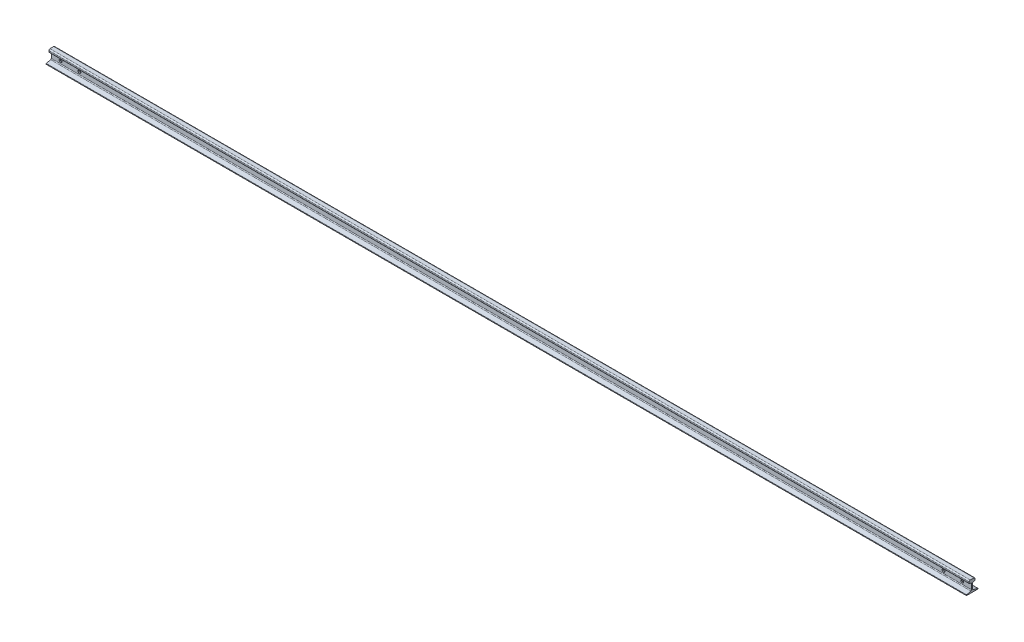
ISO-10303-21;
HEADER;
FILE_DESCRIPTION(('STEP AP214'),'2;1');
FILE_NAME('part.step','',(''),(''),'','','');
FILE_SCHEMA(('AUTOMOTIVE_DESIGN { 1 0 10303 214 1 1 1 1 }'));
ENDSEC;
DATA;
#1=APPLICATION_CONTEXT('core data for automotive mechanical design processes');
#2=APPLICATION_PROTOCOL_DEFINITION('international standard','automotive_design',2000,#1);
#3=PRODUCT_CONTEXT('',#1,'mechanical');
#4=PRODUCT('Part','Part','',(#3));
#5=PRODUCT_RELATED_PRODUCT_CATEGORY('part','',(#4));
#6=PRODUCT_DEFINITION_FORMATION('','',#4);
#7=PRODUCT_DEFINITION_CONTEXT('part definition',#1,'design');
#8=PRODUCT_DEFINITION('design','',#6,#7);
#9=PRODUCT_DEFINITION_SHAPE('','',#8);
#10=(LENGTH_UNIT() NAMED_UNIT(*) SI_UNIT(.MILLI.,.METRE.));
#11=(NAMED_UNIT(*) PLANE_ANGLE_UNIT() SI_UNIT($,.RADIAN.));
#12=(NAMED_UNIT(*) SI_UNIT($,.STERADIAN.) SOLID_ANGLE_UNIT());
#13=UNCERTAINTY_MEASURE_WITH_UNIT(LENGTH_MEASURE(1.E-05),#10,'distance_accuracy_value','');
#14=(GEOMETRIC_REPRESENTATION_CONTEXT(3) GLOBAL_UNCERTAINTY_ASSIGNED_CONTEXT((#13)) GLOBAL_UNIT_ASSIGNED_CONTEXT((#10,
#11,#12)) REPRESENTATION_CONTEXT('',''));
#15=CARTESIAN_POINT('',(0.,0.,0.));
#16=DIRECTION('',(0.,0.,1.));
#17=DIRECTION('',(1.,0.,0.));
#18=AXIS2_PLACEMENT_3D('',#15,#16,#17);
#19=CARTESIAN_POINT('',(5000.,-241.3,0.));
#20=DIRECTION('',(-1.,0.,0.));
#21=DIRECTION('',(0.,0.,1.));
#22=AXIS2_PLACEMENT_3D('',#19,#20,#21);
#23=CYLINDRICAL_SURFACE('',#22,304.8);
#24=CARTESIAN_POINT('',(5000.,-241.3,0.));
#25=DIRECTION('',(1.,0.,0.));
#26=DIRECTION('',(0.,0.,1.));
#27=AXIS2_PLACEMENT_3D('',#24,#25,#26);
#28=CIRCLE('',#27,304.8);
#29=CARTESIAN_POINT('',(5000.,63.3389725171073,-9.90638297872341));
#30=VERTEX_POINT('',#29);
#31=CARTESIAN_POINT('',(5000.,63.3389725171073,9.90638297872341));
#32=VERTEX_POINT('',#31);
#33=EDGE_CURVE('E221',#30,#32,#28,.T.);
#34=ORIENTED_EDGE('',*,*,#33,.F.);
#35=DIRECTION('',(-1.,0.,0.));
#36=VECTOR('',#35,1.);
#37=CARTESIAN_POINT('',(5000.,63.3389725171074,-9.90638297872341));
#38=LINE('',#37,#36);
#39=CARTESIAN_POINT('',(0.,63.3389725171073,-9.90638297872341));
#40=VERTEX_POINT('',#39);
#41=EDGE_CURVE('E207',#30,#40,#38,.T.);
#42=ORIENTED_EDGE('',*,*,#41,.T.);
#43=CARTESIAN_POINT('',(0.,-241.3,0.));
#44=DIRECTION('',(1.,0.,0.));
#45=DIRECTION('',(0.,0.,1.));
#46=AXIS2_PLACEMENT_3D('',#43,#44,#45);
#47=CIRCLE('',#46,304.8);
#48=CARTESIAN_POINT('',(0.,63.3389725171073,9.90638297872341));
#49=VERTEX_POINT('',#48);
#50=EDGE_CURVE('E218',#40,#49,#47,.T.);
#51=ORIENTED_EDGE('',*,*,#50,.T.);
#52=DIRECTION('',(-1.,0.,0.));
#53=VECTOR('',#52,1.);
#54=CARTESIAN_POINT('',(5000.,63.3389725171074,9.90638297872341));
#55=LINE('',#54,#53);
#56=EDGE_CURVE('E222',#49,#32,#55,.F.);
#57=ORIENTED_EDGE('',*,*,#56,.T.);
#58=EDGE_LOOP('',(#34,#42,#51,#57));
#59=FACE_BOUND('',#58,.T.);
#60=ADVANCED_FACE('F38',(#59),#23,.T.);
#61=CARTESIAN_POINT('',(5000.,63.0771303826883,16.05));
#62=DIRECTION('',(0.,0.,-1.));
#63=DIRECTION('',(0.,1.,0.));
#64=AXIS2_PLACEMENT_3D('',#61,#62,#63);
#65=PLANE('',#64);
#66=DIRECTION('',(0.,-1.,0.));
#67=VECTOR('',#66,1.);
#68=CARTESIAN_POINT('',(0.,63.0771303826883,16.05));
#69=LINE('',#68,#67);
#70=CARTESIAN_POINT('',(0.,56.9923272563342,16.05));
#71=VERTEX_POINT('',#70);
#72=CARTESIAN_POINT('',(0.,50.3091164112466,16.05));
#73=VERTEX_POINT('',#72);
#74=EDGE_CURVE('E226',#71,#73,#69,.T.);
#75=ORIENTED_EDGE('',*,*,#74,.T.);
#76=DIRECTION('',(-1.,0.,0.));
#77=VECTOR('',#76,1.);
#78=CARTESIAN_POINT('',(5000.,50.3091164112466,16.05));
#79=LINE('',#78,#77);
#80=CARTESIAN_POINT('',(5000.,50.3091164112466,16.05));
#81=VERTEX_POINT('',#80);
#82=EDGE_CURVE('E345',#73,#81,#79,.F.);
#83=ORIENTED_EDGE('',*,*,#82,.T.);
#84=DIRECTION('',(0.,-1.,0.));
#85=VECTOR('',#84,1.);
#86=CARTESIAN_POINT('',(5000.,63.0771303826883,16.05));
#87=LINE('',#86,#85);
#88=CARTESIAN_POINT('',(5000.,56.9923272563342,16.05));
#89=VERTEX_POINT('',#88);
#90=EDGE_CURVE('E384',#89,#81,#87,.T.);
#91=ORIENTED_EDGE('',*,*,#90,.F.);
#92=DIRECTION('',(-1.,0.,0.));
#93=VECTOR('',#92,1.);
#94=CARTESIAN_POINT('',(5000.,56.9923272563342,16.05));
#95=LINE('',#94,#93);
#96=EDGE_CURVE('E271',#89,#71,#95,.T.);
#97=ORIENTED_EDGE('',*,*,#96,.T.);
#98=EDGE_LOOP('',(#75,#83,#91,#97));
#99=FACE_BOUND('',#98,.T.);
#100=ADVANCED_FACE('F439',(#99),#65,.F.);
#101=CARTESIAN_POINT('',(5000.,49.0443733037448,16.05));
#102=DIRECTION('',(0.,0.974370064785237,-0.224951054343858));
#103=DIRECTION('',(0.,0.224951054343858,0.974370064785237));
#104=AXIS2_PLACEMENT_3D('',#101,#102,#103);
#105=PLANE('',#104);
#106=DIRECTION('',(0.,-0.224951054343858,-0.974370064785237));
#107=VECTOR('',#106,1.);
#108=CARTESIAN_POINT('',(5000.,49.0443733037448,16.05));
#109=LINE('',#108,#107);
#110=CARTESIAN_POINT('',(5000.,48.7598680082381,14.8176721764067));
#111=VERTEX_POINT('',#110);
#112=CARTESIAN_POINT('',(5000.,46.8717265450388,6.63923298132323));
#113=VERTEX_POINT('',#112);
#114=EDGE_CURVE('E387',#111,#113,#109,.T.);
#115=ORIENTED_EDGE('',*,*,#114,.F.);
#116=DIRECTION('',(-1.,0.,0.));
#117=VECTOR('',#116,1.);
#118=CARTESIAN_POINT('',(5000.,48.7598680082381,14.8176721764067));
#119=LINE('',#118,#117);
#120=CARTESIAN_POINT('',(0.,48.7598680082381,14.8176721764067));
#121=VERTEX_POINT('',#120);
#122=EDGE_CURVE('E342',#111,#121,#119,.T.);
#123=ORIENTED_EDGE('',*,*,#122,.T.);
#124=DIRECTION('',(0.,-0.224951054343858,-0.974370064785237));
#125=VECTOR('',#124,1.);
#126=CARTESIAN_POINT('',(0.,49.0443733037448,16.05));
#127=LINE('',#126,#125);
#128=CARTESIAN_POINT('',(0.,46.8717265450388,6.63923298132323));
#129=VERTEX_POINT('',#128);
#130=EDGE_CURVE('E230',#121,#129,#127,.T.);
#131=ORIENTED_EDGE('',*,*,#130,.T.);
#132=DIRECTION('',(-1.,0.,0.));
#133=VECTOR('',#132,1.);
#134=CARTESIAN_POINT('',(5000.,46.8717265450388,6.63923298132323));
#135=LINE('',#134,#133);
#136=EDGE_CURVE('E290',#129,#113,#135,.F.);
#137=ORIENTED_EDGE('',*,*,#136,.T.);
#138=EDGE_LOOP('',(#115,#123,#131,#137));
#139=FACE_BOUND('',#138,.T.);
#140=ADVANCED_FACE('F445',(#139),#105,.F.);
#141=CARTESIAN_POINT('',(5000.,46.02,2.95));
#142=DIRECTION('',(0.,0.,-1.));
#143=DIRECTION('',(0.,1.,0.));
#144=AXIS2_PLACEMENT_3D('',#141,#142,#143);
#145=PLANE('',#144);
#146=CARTESIAN_POINT('',(4949.2,27.9989725171073,2.94999999982792));
#147=DIRECTION('',(0.,0.,1.));
#148=DIRECTION('',(1.,0.,0.));
#149=AXIS2_PLACEMENT_3D('',#146,#147,#148);
#150=CIRCLE('',#149,8.00000000000041);
#151=CARTESIAN_POINT('',(4957.2,27.9989725171073,2.94999999982792));
#152=VERTEX_POINT('',#151);
#153=EDGE_CURVE('E378',#152,#152,#150,.T.);
#154=ORIENTED_EDGE('',*,*,#153,.F.);
#155=EDGE_LOOP('',(#154));
#156=FACE_BOUND('',#155,.T.);
#157=CARTESIAN_POINT('',(4847.6,27.9989725171073,2.94999999982792));
#158=DIRECTION('',(0.,0.,1.));
#159=DIRECTION('',(1.,0.,0.));
#160=AXIS2_PLACEMENT_3D('',#157,#158,#159);
#161=CIRCLE('',#160,8.00000000000041);
#162=CARTESIAN_POINT('',(4855.6,27.9989725171073,2.94999999982792));
#163=VERTEX_POINT('',#162);
#164=EDGE_CURVE('E368',#163,#163,#161,.T.);
#165=ORIENTED_EDGE('',*,*,#164,.F.);
#166=EDGE_LOOP('',(#165));
#167=FACE_BOUND('',#166,.T.);
#168=CARTESIAN_POINT('',(152.4,27.9989725171073,2.94999999982792));
#169=DIRECTION('',(0.,0.,1.));
#170=DIRECTION('',(1.,0.,0.));
#171=AXIS2_PLACEMENT_3D('',#168,#169,#170);
#172=CIRCLE('',#171,7.99999999999998);
#173=CARTESIAN_POINT('',(160.4,27.9989725171073,2.94999999982792));
#174=VERTEX_POINT('',#173);
#175=EDGE_CURVE('E365',#174,#174,#172,.T.);
#176=ORIENTED_EDGE('',*,*,#175,.F.);
#177=EDGE_LOOP('',(#176));
#178=FACE_BOUND('',#177,.T.);
#179=CARTESIAN_POINT('',(50.8,27.9989725171073,2.94999999982792));
#180=DIRECTION('',(0.,0.,1.));
#181=DIRECTION('',(1.,0.,0.));
#182=AXIS2_PLACEMENT_3D('',#179,#180,#181);
#183=CIRCLE('',#182,7.99999999999998);
#184=CARTESIAN_POINT('',(58.8,27.9989725171073,2.94999999982792));
#185=VERTEX_POINT('',#184);
#186=EDGE_CURVE('E233',#185,#185,#183,.T.);
#187=ORIENTED_EDGE('',*,*,#186,.F.);
#188=EDGE_LOOP('',(#187));
#189=FACE_BOUND('',#188,.T.);
#190=DIRECTION('',(0.,-1.,0.));
#191=VECTOR('',#190,1.);
#192=CARTESIAN_POINT('',(5000.,46.02,2.95));
#193=LINE('',#192,#191);
#194=CARTESIAN_POINT('',(5000.,42.2337250366611,2.95));
#195=VERTEX_POINT('',#194);
#196=CARTESIAN_POINT('',(5000.,14.0862749633389,2.95));
#197=VERTEX_POINT('',#196);
#198=EDGE_CURVE('E389',#195,#197,#193,.T.);
#199=ORIENTED_EDGE('',*,*,#198,.F.);
#200=DIRECTION('',(-1.,0.,0.));
#201=VECTOR('',#200,1.);
#202=CARTESIAN_POINT('',(0.,42.2337250366611,2.95));
#203=LINE('',#202,#201);
#204=CARTESIAN_POINT('',(0.,42.2337250366611,2.95));
#205=VERTEX_POINT('',#204);
#206=EDGE_CURVE('E287',#195,#205,#203,.T.);
#207=ORIENTED_EDGE('',*,*,#206,.T.);
#208=DIRECTION('',(0.,-1.,0.));
#209=VECTOR('',#208,1.);
#210=CARTESIAN_POINT('',(0.,46.02,2.95));
#211=LINE('',#210,#209);
#212=CARTESIAN_POINT('',(0.,14.0862749633389,2.95));
#213=VERTEX_POINT('',#212);
#214=EDGE_CURVE('E240',#205,#213,#211,.T.);
#215=ORIENTED_EDGE('',*,*,#214,.T.);
#216=DIRECTION('',(-1.,0.,0.));
#217=VECTOR('',#216,1.);
#218=CARTESIAN_POINT('',(5000.,14.0862749633389,2.95));
#219=LINE('',#218,#217);
#220=EDGE_CURVE('E285',#213,#197,#219,.F.);
#221=ORIENTED_EDGE('',*,*,#220,.T.);
#222=EDGE_LOOP('',(#199,#207,#215,#221));
#223=FACE_BOUND('',#222,.T.);
#224=ADVANCED_FACE('F474',(#156,#167,#178,#189,#223),#145,.F.);
#225=CARTESIAN_POINT('',(5000.,10.3,2.95));
#226=DIRECTION('',(0.,-0.974370064785237,-0.224951054343858));
#227=DIRECTION('',(0.,0.224951054343858,-0.974370064785237));
#228=AXIS2_PLACEMENT_3D('',#225,#226,#227);
#229=PLANE('',#228);
#230=DIRECTION('',(0.,-0.224951054343858,0.974370064785237));
#231=VECTOR('',#230,1.);
#232=CARTESIAN_POINT('',(0.,10.3,2.95));
#233=LINE('',#232,#231);
#234=CARTESIAN_POINT('',(0.,9.44827345496116,6.63923298132323));
#235=VERTEX_POINT('',#234);
#236=CARTESIAN_POINT('',(0.,3.93550139109065,30.5176721764067));
#237=VERTEX_POINT('',#236);
#238=EDGE_CURVE('E243',#235,#237,#233,.T.);
#239=ORIENTED_EDGE('',*,*,#238,.T.);
#240=DIRECTION('',(-1.,0.,0.));
#241=VECTOR('',#240,1.);
#242=CARTESIAN_POINT('',(5000.,3.93550139109065,30.5176721764067));
#243=LINE('',#242,#241);
#244=CARTESIAN_POINT('',(5000.,3.93550139109065,30.5176721764067));
#245=VERTEX_POINT('',#244);
#246=EDGE_CURVE('E11',#237,#245,#243,.F.);
#247=ORIENTED_EDGE('',*,*,#246,.T.);
#248=DIRECTION('',(0.,-0.224951054343858,0.974370064785237));
#249=VECTOR('',#248,1.);
#250=CARTESIAN_POINT('',(5000.,10.3,2.95));
#251=LINE('',#250,#249);
#252=CARTESIAN_POINT('',(5000.,9.44827345496116,6.63923298132323));
#253=VERTEX_POINT('',#252);
#254=EDGE_CURVE('E392',#253,#245,#251,.T.);
#255=ORIENTED_EDGE('',*,*,#254,.F.);
#256=DIRECTION('',(-1.,0.,0.));
#257=VECTOR('',#256,1.);
#258=CARTESIAN_POINT('',(0.,9.44827345496116,6.63923298132323));
#259=LINE('',#258,#257);
#260=EDGE_CURVE('E293',#253,#235,#259,.T.);
#261=ORIENTED_EDGE('',*,*,#260,.T.);
#262=EDGE_LOOP('',(#239,#247,#255,#261));
#263=FACE_BOUND('',#262,.T.);
#264=ADVANCED_FACE('F481',(#263),#229,.F.);
#265=CARTESIAN_POINT('',(5000.,3.65099609558399,31.75));
#266=DIRECTION('',(0.,0.,-1.));
#267=DIRECTION('',(-1.,0.,0.));
#268=AXIS2_PLACEMENT_3D('',#265,#266,#267);
#269=PLANE('',#268);
#270=DIRECTION('',(0.,-1.,0.));
#271=VECTOR('',#270,1.);
#272=CARTESIAN_POINT('',(0.,3.65099609558399,31.75));
#273=LINE('',#272,#271);
#274=CARTESIAN_POINT('',(0.,2.38625298808213,31.75));
#275=VERTEX_POINT('',#274);
#276=CARTESIAN_POINT('',(0.,1.59,31.75));
#277=VERTEX_POINT('',#276);
#278=EDGE_CURVE('E246',#275,#277,#273,.T.);
#279=ORIENTED_EDGE('',*,*,#278,.T.);
#280=DIRECTION('',(-1.,0.,0.));
#281=VECTOR('',#280,1.);
#282=CARTESIAN_POINT('',(5000.,1.59,31.75));
#283=LINE('',#282,#281);
#284=CARTESIAN_POINT('',(5000.,1.59,31.75));
#285=VERTEX_POINT('',#284);
#286=EDGE_CURVE('E47',#277,#285,#283,.F.);
#287=ORIENTED_EDGE('',*,*,#286,.T.);
#288=DIRECTION('',(0.,-1.,0.));
#289=VECTOR('',#288,1.);
#290=CARTESIAN_POINT('',(5000.,3.65099609558399,31.75));
#291=LINE('',#290,#289);
#292=CARTESIAN_POINT('',(5000.,2.38625298808213,31.75));
#293=VERTEX_POINT('',#292);
#294=EDGE_CURVE('E395',#293,#285,#291,.T.);
#295=ORIENTED_EDGE('',*,*,#294,.F.);
#296=DIRECTION('',(-1.,0.,0.));
#297=VECTOR('',#296,1.);
#298=CARTESIAN_POINT('',(5000.,2.38625298808213,31.75));
#299=LINE('',#298,#297);
#300=EDGE_CURVE('E359',#293,#275,#299,.T.);
#301=ORIENTED_EDGE('',*,*,#300,.T.);
#302=EDGE_LOOP('',(#279,#287,#295,#301));
#303=FACE_BOUND('',#302,.T.);
#304=ADVANCED_FACE('F489',(#303),#269,.F.);
#305=CARTESIAN_POINT('',(5000.,0.,-31.75));
#306=DIRECTION('',(0.,1.,0.));
#307=DIRECTION('',(0.,0.,1.));
#308=AXIS2_PLACEMENT_3D('',#305,#306,#307);
#309=PLANE('',#308);
#310=DIRECTION('',(0.,0.,-1.));
#311=VECTOR('',#310,1.);
#312=CARTESIAN_POINT('',(0.,0.,-31.75));
#313=LINE('',#312,#311);
#314=CARTESIAN_POINT('',(0.,0.,30.16));
#315=VERTEX_POINT('',#314);
#316=CARTESIAN_POINT('',(0.,0.,-30.16));
#317=VERTEX_POINT('',#316);
#318=EDGE_CURVE('E249',#315,#317,#313,.T.);
#319=ORIENTED_EDGE('',*,*,#318,.T.);
#320=DIRECTION('',(-1.,0.,0.));
#321=VECTOR('',#320,1.);
#322=CARTESIAN_POINT('',(5000.,0.,-30.16));
#323=LINE('',#322,#321);
#324=CARTESIAN_POINT('',(5000.,0.,-30.16));
#325=VERTEX_POINT('',#324);
#326=EDGE_CURVE('E354',#317,#325,#323,.F.);
#327=ORIENTED_EDGE('',*,*,#326,.T.);
#328=DIRECTION('',(0.,0.,-1.));
#329=VECTOR('',#328,1.);
#330=CARTESIAN_POINT('',(5000.,0.,-31.75));
#331=LINE('',#330,#329);
#332=CARTESIAN_POINT('',(5000.,0.,30.16));
#333=VERTEX_POINT('',#332);
#334=EDGE_CURVE('E398',#333,#325,#331,.T.);
#335=ORIENTED_EDGE('',*,*,#334,.F.);
#336=DIRECTION('',(-1.,0.,0.));
#337=VECTOR('',#336,1.);
#338=CARTESIAN_POINT('',(5000.,0.,30.16));
#339=LINE('',#338,#337);
#340=EDGE_CURVE('E351',#333,#315,#339,.T.);
#341=ORIENTED_EDGE('',*,*,#340,.T.);
#342=EDGE_LOOP('',(#319,#327,#335,#341));
#343=FACE_BOUND('',#342,.T.);
#344=ADVANCED_FACE('F498',(#343),#309,.F.);
#345=CARTESIAN_POINT('',(5000.,3.65099609558399,-31.75));
#346=DIRECTION('',(0.,0.,1.));
#347=DIRECTION('',(1.,0.,0.));
#348=AXIS2_PLACEMENT_3D('',#345,#346,#347);
#349=PLANE('',#348);
#350=DIRECTION('',(0.,1.,0.));
#351=VECTOR('',#350,1.);
#352=CARTESIAN_POINT('',(5000.,3.65099609558399,-31.75));
#353=LINE('',#352,#351);
#354=CARTESIAN_POINT('',(5000.,1.59,-31.75));
#355=VERTEX_POINT('',#354);
#356=CARTESIAN_POINT('',(5000.,2.38625298808213,-31.75));
#357=VERTEX_POINT('',#356);
#358=EDGE_CURVE('E401',#355,#357,#353,.T.);
#359=ORIENTED_EDGE('',*,*,#358,.F.);
#360=DIRECTION('',(-1.,0.,0.));
#361=VECTOR('',#360,1.);
#362=CARTESIAN_POINT('',(5000.,1.59,-31.75));
#363=LINE('',#362,#361);
#364=CARTESIAN_POINT('',(0.,1.59,-31.75));
#365=VERTEX_POINT('',#364);
#366=EDGE_CURVE('E348',#355,#365,#363,.T.);
#367=ORIENTED_EDGE('',*,*,#366,.T.);
#368=DIRECTION('',(0.,1.,0.));
#369=VECTOR('',#368,1.);
#370=CARTESIAN_POINT('',(0.,3.65099609558399,-31.75));
#371=LINE('',#370,#369);
#372=CARTESIAN_POINT('',(0.,2.38625298808213,-31.75));
#373=VERTEX_POINT('',#372);
#374=EDGE_CURVE('E252',#365,#373,#371,.T.);
#375=ORIENTED_EDGE('',*,*,#374,.T.);
#376=DIRECTION('',(-1.,0.,0.));
#377=VECTOR('',#376,1.);
#378=CARTESIAN_POINT('',(5000.,2.38625298808213,-31.75));
#379=LINE('',#378,#377);
#380=EDGE_CURVE('E63',#373,#357,#379,.F.);
#381=ORIENTED_EDGE('',*,*,#380,.T.);
#382=EDGE_LOOP('',(#359,#367,#375,#381));
#383=FACE_BOUND('',#382,.T.);
#384=ADVANCED_FACE('F503',(#383),#349,.F.);
#385=CARTESIAN_POINT('',(5000.,10.3,-2.95));
#386=DIRECTION('',(0.,-0.974370064785237,0.224951054343858));
#387=DIRECTION('',(0.,-0.224951054343858,-0.974370064785237));
#388=AXIS2_PLACEMENT_3D('',#385,#386,#387);
#389=PLANE('',#388);
#390=DIRECTION('',(0.,0.224951054343858,0.974370064785237));
#391=VECTOR('',#390,1.);
#392=CARTESIAN_POINT('',(5000.,10.3,-2.95));
#393=LINE('',#392,#391);
#394=CARTESIAN_POINT('',(5000.,3.93550139109065,-30.5176721764067));
#395=VERTEX_POINT('',#394);
#396=CARTESIAN_POINT('',(5000.,9.44827345496116,-6.63923298132323));
#397=VERTEX_POINT('',#396);
#398=EDGE_CURVE('E403',#395,#397,#393,.T.);
#399=ORIENTED_EDGE('',*,*,#398,.F.);
#400=DIRECTION('',(-1.,0.,0.));
#401=VECTOR('',#400,1.);
#402=CARTESIAN_POINT('',(5000.,3.93550139109065,-30.5176721764067));
#403=LINE('',#402,#401);
#404=CARTESIAN_POINT('',(0.,3.93550139109065,-30.5176721764067));
#405=VERTEX_POINT('',#404);
#406=EDGE_CURVE('E356',#395,#405,#403,.T.);
#407=ORIENTED_EDGE('',*,*,#406,.T.);
#408=DIRECTION('',(0.,0.224951054343858,0.974370064785237));
#409=VECTOR('',#408,1.);
#410=CARTESIAN_POINT('',(0.,10.3,-2.95));
#411=LINE('',#410,#409);
#412=CARTESIAN_POINT('',(0.,9.44827345496116,-6.63923298132323));
#413=VERTEX_POINT('',#412);
#414=EDGE_CURVE('E254',#405,#413,#411,.T.);
#415=ORIENTED_EDGE('',*,*,#414,.T.);
#416=DIRECTION('',(-1.,0.,0.));
#417=VECTOR('',#416,1.);
#418=CARTESIAN_POINT('',(5000.,9.44827345496116,-6.63923298132323));
#419=LINE('',#418,#417);
#420=EDGE_CURVE('E282',#413,#397,#419,.F.);
#421=ORIENTED_EDGE('',*,*,#420,.T.);
#422=EDGE_LOOP('',(#399,#407,#415,#421));
#423=FACE_BOUND('',#422,.T.);
#424=ADVANCED_FACE('F510',(#423),#389,.F.);
#425=CARTESIAN_POINT('',(5000.,46.02,-2.95));
#426=DIRECTION('',(0.,0.,1.));
#427=DIRECTION('',(0.,-1.,0.));
#428=AXIS2_PLACEMENT_3D('',#425,#426,#427);
#429=PLANE('',#428);
#430=CARTESIAN_POINT('',(4949.2,27.9989725171073,-2.95));
#431=DIRECTION('',(0.,0.,1.));
#432=DIRECTION('',(0.,-1.,0.));
#433=AXIS2_PLACEMENT_3D('',#430,#431,#432);
#434=CIRCLE('',#433,8.00000000000041);
#435=CARTESIAN_POINT('',(4949.2,19.9989725171069,-2.95));
#436=VERTEX_POINT('',#435);
#437=EDGE_CURVE('E42',#436,#436,#434,.T.);
#438=ORIENTED_EDGE('',*,*,#437,.T.);
#439=EDGE_LOOP('',(#438));
#440=FACE_BOUND('',#439,.T.);
#441=CARTESIAN_POINT('',(4847.6,27.9989725171073,-2.95));
#442=DIRECTION('',(0.,0.,1.));
#443=DIRECTION('',(0.,-1.,0.));
#444=AXIS2_PLACEMENT_3D('',#441,#442,#443);
#445=CIRCLE('',#444,8.00000000000041);
#446=CARTESIAN_POINT('',(4847.6,19.9989725171069,-2.95));
#447=VERTEX_POINT('',#446);
#448=EDGE_CURVE('E366',#447,#447,#445,.T.);
#449=ORIENTED_EDGE('',*,*,#448,.T.);
#450=EDGE_LOOP('',(#449));
#451=FACE_BOUND('',#450,.T.);
#452=CARTESIAN_POINT('',(152.4,27.9989725171073,-2.95));
#453=DIRECTION('',(0.,0.,1.));
#454=DIRECTION('',(0.,-1.,0.));
#455=AXIS2_PLACEMENT_3D('',#452,#453,#454);
#456=CIRCLE('',#455,7.99999999999998);
#457=CARTESIAN_POINT('',(152.4,19.9989725171073,-2.95));
#458=VERTEX_POINT('',#457);
#459=EDGE_CURVE('E363',#458,#458,#456,.T.);
#460=ORIENTED_EDGE('',*,*,#459,.T.);
#461=EDGE_LOOP('',(#460));
#462=FACE_BOUND('',#461,.T.);
#463=CARTESIAN_POINT('',(50.8,27.9989725171073,-2.95));
#464=DIRECTION('',(0.,0.,1.));
#465=DIRECTION('',(0.,-1.,0.));
#466=AXIS2_PLACEMENT_3D('',#463,#464,#465);
#467=CIRCLE('',#466,7.99999999999998);
#468=CARTESIAN_POINT('',(50.8,19.9989725171073,-2.95));
#469=VERTEX_POINT('',#468);
#470=EDGE_CURVE('E227',#469,#469,#467,.T.);
#471=ORIENTED_EDGE('',*,*,#470,.T.);
#472=EDGE_LOOP('',(#471));
#473=FACE_BOUND('',#472,.T.);
#474=DIRECTION('',(0.,1.,0.));
#475=VECTOR('',#474,1.);
#476=CARTESIAN_POINT('',(0.,46.02,-2.95));
#477=LINE('',#476,#475);
#478=CARTESIAN_POINT('',(0.,14.0862749633389,-2.95));
#479=VERTEX_POINT('',#478);
#480=CARTESIAN_POINT('',(0.,42.2337250366611,-2.95));
#481=VERTEX_POINT('',#480);
#482=EDGE_CURVE('E256',#479,#481,#477,.T.);
#483=ORIENTED_EDGE('',*,*,#482,.T.);
#484=DIRECTION('',(-1.,0.,0.));
#485=VECTOR('',#484,1.);
#486=CARTESIAN_POINT('',(5000.,42.2337250366611,-2.95));
#487=LINE('',#486,#485);
#488=CARTESIAN_POINT('',(5000.,42.2337250366611,-2.95));
#489=VERTEX_POINT('',#488);
#490=EDGE_CURVE('E280',#481,#489,#487,.F.);
#491=ORIENTED_EDGE('',*,*,#490,.T.);
#492=DIRECTION('',(0.,1.,0.));
#493=VECTOR('',#492,1.);
#494=CARTESIAN_POINT('',(5000.,46.02,-2.95));
#495=LINE('',#494,#493);
#496=CARTESIAN_POINT('',(5000.,14.0862749633389,-2.95));
#497=VERTEX_POINT('',#496);
#498=EDGE_CURVE('E405',#497,#489,#495,.T.);
#499=ORIENTED_EDGE('',*,*,#498,.F.);
#500=DIRECTION('',(-1.,0.,0.));
#501=VECTOR('',#500,1.);
#502=CARTESIAN_POINT('',(0.,14.0862749633389,-2.95));
#503=LINE('',#502,#501);
#504=EDGE_CURVE('E277',#497,#479,#503,.T.);
#505=ORIENTED_EDGE('',*,*,#504,.T.);
#506=EDGE_LOOP('',(#483,#491,#499,#505));
#507=FACE_BOUND('',#506,.T.);
#508=ADVANCED_FACE('F517',(#440,#451,#462,#473,#507),#429,.F.);
#509=CARTESIAN_POINT('',(5000.,49.0443733037448,-16.05));
#510=DIRECTION('',(0.,0.974370064785237,0.224951054343858));
#511=DIRECTION('',(0.,-0.224951054343858,0.974370064785237));
#512=AXIS2_PLACEMENT_3D('',#509,#510,#511);
#513=PLANE('',#512);
#514=DIRECTION('',(0.,0.224951054343858,-0.974370064785237));
#515=VECTOR('',#514,1.);
#516=CARTESIAN_POINT('',(0.,49.0443733037448,-16.05));
#517=LINE('',#516,#515);
#518=CARTESIAN_POINT('',(0.,46.8717265450388,-6.63923298132323));
#519=VERTEX_POINT('',#518);
#520=CARTESIAN_POINT('',(0.,48.7598680082381,-14.8176721764067));
#521=VERTEX_POINT('',#520);
#522=EDGE_CURVE('E259',#519,#521,#517,.T.);
#523=ORIENTED_EDGE('',*,*,#522,.T.);
#524=DIRECTION('',(-1.,0.,0.));
#525=VECTOR('',#524,1.);
#526=CARTESIAN_POINT('',(5000.,48.7598680082381,-14.8176721764067));
#527=LINE('',#526,#525);
#528=CARTESIAN_POINT('',(5000.,48.7598680082381,-14.8176721764067));
#529=VERTEX_POINT('',#528);
#530=EDGE_CURVE('E329',#521,#529,#527,.F.);
#531=ORIENTED_EDGE('',*,*,#530,.T.);
#532=DIRECTION('',(0.,0.224951054343858,-0.974370064785237));
#533=VECTOR('',#532,1.);
#534=CARTESIAN_POINT('',(5000.,49.0443733037448,-16.05));
#535=LINE('',#534,#533);
#536=CARTESIAN_POINT('',(5000.,46.8717265450388,-6.63923298132323));
#537=VERTEX_POINT('',#536);
#538=EDGE_CURVE('E407',#537,#529,#535,.T.);
#539=ORIENTED_EDGE('',*,*,#538,.F.);
#540=DIRECTION('',(-1.,0.,0.));
#541=VECTOR('',#540,1.);
#542=CARTESIAN_POINT('',(0.,46.8717265450388,-6.63923298132323));
#543=LINE('',#542,#541);
#544=EDGE_CURVE('E274',#537,#519,#543,.T.);
#545=ORIENTED_EDGE('',*,*,#544,.T.);
#546=EDGE_LOOP('',(#523,#531,#539,#545));
#547=FACE_BOUND('',#546,.T.);
#548=ADVANCED_FACE('F420',(#547),#513,.F.);
#549=CARTESIAN_POINT('',(5000.,63.0771303826883,-16.05));
#550=DIRECTION('',(0.,0.,1.));
#551=DIRECTION('',(0.,-1.,0.));
#552=AXIS2_PLACEMENT_3D('',#549,#550,#551);
#553=PLANE('',#552);
#554=DIRECTION('',(0.,1.,0.));
#555=VECTOR('',#554,1.);
#556=CARTESIAN_POINT('',(5000.,63.0771303826883,-16.05));
#557=LINE('',#556,#555);
#558=CARTESIAN_POINT('',(5000.,50.3091164112466,-16.05));
#559=VERTEX_POINT('',#558);
#560=CARTESIAN_POINT('',(5000.,56.9923272563342,-16.05));
#561=VERTEX_POINT('',#560);
#562=EDGE_CURVE('E236',#559,#561,#557,.T.);
#563=ORIENTED_EDGE('',*,*,#562,.F.);
#564=DIRECTION('',(-1.,0.,0.));
#565=VECTOR('',#564,1.);
#566=CARTESIAN_POINT('',(5000.,50.3091164112466,-16.05));
#567=LINE('',#566,#565);
#568=CARTESIAN_POINT('',(0.,50.3091164112466,-16.05));
#569=VERTEX_POINT('',#568);
#570=EDGE_CURVE('E314',#559,#569,#567,.T.);
#571=ORIENTED_EDGE('',*,*,#570,.T.);
#572=DIRECTION('',(0.,1.,0.));
#573=VECTOR('',#572,1.);
#574=CARTESIAN_POINT('',(0.,63.0771303826883,-16.05));
#575=LINE('',#574,#573);
#576=CARTESIAN_POINT('',(0.,56.9923272563342,-16.05));
#577=VERTEX_POINT('',#576);
#578=EDGE_CURVE('E262',#569,#577,#575,.T.);
#579=ORIENTED_EDGE('',*,*,#578,.T.);
#580=DIRECTION('',(-1.,0.,0.));
#581=VECTOR('',#580,1.);
#582=CARTESIAN_POINT('',(5000.,56.9923272563342,-16.05));
#583=LINE('',#582,#581);
#584=EDGE_CURVE('E209',#577,#561,#583,.F.);
#585=ORIENTED_EDGE('',*,*,#584,.T.);
#586=EDGE_LOOP('',(#563,#571,#579,#585));
#587=FACE_BOUND('',#586,.T.);
#588=ADVANCED_FACE('F415',(#587),#553,.F.);
#589=CARTESIAN_POINT('',(5000.,-241.3,0.));
#590=DIRECTION('',(-1.,0.,0.));
#591=DIRECTION('',(0.,0.,1.));
#592=AXIS2_PLACEMENT_3D('',#589,#590,#591);
#593=PLANE('',#592);
#594=ORIENTED_EDGE('',*,*,#538,.T.);
#595=CARTESIAN_POINT('',(5000.,50.3091164112466,-14.46));
#596=DIRECTION('',(-1.,0.,0.));
#597=DIRECTION('',(0.,0.,1.));
#598=AXIS2_PLACEMENT_3D('',#595,#596,#597);
#599=CIRCLE('',#598,1.59);
#600=EDGE_CURVE('E340',#529,#559,#599,.F.);
#601=ORIENTED_EDGE('',*,*,#600,.T.);
#602=ORIENTED_EDGE('',*,*,#562,.T.);
#603=CARTESIAN_POINT('',(5000.,56.9923272563342,-9.7));
#604=DIRECTION('',(-1.,0.,0.));
#605=DIRECTION('',(0.,0.,1.));
#606=AXIS2_PLACEMENT_3D('',#603,#604,#605);
#607=CIRCLE('',#606,6.35);
#608=EDGE_CURVE('E269',#561,#30,#607,.F.);
#609=ORIENTED_EDGE('',*,*,#608,.T.);
#610=ORIENTED_EDGE('',*,*,#33,.T.);
#611=CARTESIAN_POINT('',(5000.,56.9923272563342,9.7));
#612=DIRECTION('',(-1.,0.,0.));
#613=DIRECTION('',(0.,0.,1.));
#614=AXIS2_PLACEMENT_3D('',#611,#612,#613);
#615=CIRCLE('',#614,6.35);
#616=EDGE_CURVE('E267',#32,#89,#615,.F.);
#617=ORIENTED_EDGE('',*,*,#616,.T.);
#618=ORIENTED_EDGE('',*,*,#90,.T.);
#619=CARTESIAN_POINT('',(5000.,50.3091164112466,14.46));
#620=DIRECTION('',(-1.,0.,0.));
#621=DIRECTION('',(0.,0.,1.));
#622=AXIS2_PLACEMENT_3D('',#619,#620,#621);
#623=CIRCLE('',#622,1.59);
#624=EDGE_CURVE('E338',#81,#111,#623,.F.);
#625=ORIENTED_EDGE('',*,*,#624,.T.);
#626=ORIENTED_EDGE('',*,*,#114,.T.);
#627=CARTESIAN_POINT('',(5000.,42.2337250366611,7.71));
#628=DIRECTION('',(-1.,0.,0.));
#629=DIRECTION('',(0.,0.,1.));
#630=AXIS2_PLACEMENT_3D('',#627,#628,#629);
#631=CIRCLE('',#630,4.76);
#632=EDGE_CURVE('E308',#113,#195,#631,.T.);
#633=ORIENTED_EDGE('',*,*,#632,.T.);
#634=ORIENTED_EDGE('',*,*,#198,.T.);
#635=CARTESIAN_POINT('',(5000.,14.0862749633389,7.71));
#636=DIRECTION('',(-1.,0.,0.));
#637=DIRECTION('',(0.,0.,1.));
#638=AXIS2_PLACEMENT_3D('',#635,#636,#637);
#639=CIRCLE('',#638,4.76);
#640=EDGE_CURVE('E312',#197,#253,#639,.T.);
#641=ORIENTED_EDGE('',*,*,#640,.T.);
#642=ORIENTED_EDGE('',*,*,#254,.T.);
#643=CARTESIAN_POINT('',(5000.,2.38625298808213,30.16));
#644=DIRECTION('',(-1.,0.,0.));
#645=DIRECTION('',(0.,0.,1.));
#646=AXIS2_PLACEMENT_3D('',#643,#644,#645);
#647=CIRCLE('',#646,1.59);
#648=EDGE_CURVE('E331',#245,#293,#647,.F.);
#649=ORIENTED_EDGE('',*,*,#648,.T.);
#650=ORIENTED_EDGE('',*,*,#294,.T.);
#651=CARTESIAN_POINT('',(5000.,1.59,30.16));
#652=DIRECTION('',(-1.,0.,0.));
#653=DIRECTION('',(0.,0.,1.));
#654=AXIS2_PLACEMENT_3D('',#651,#652,#653);
#655=CIRCLE('',#654,1.59);
#656=EDGE_CURVE('E333',#285,#333,#655,.F.);
#657=ORIENTED_EDGE('',*,*,#656,.T.);
#658=ORIENTED_EDGE('',*,*,#334,.T.);
#659=CARTESIAN_POINT('',(5000.,1.59,-30.16));
#660=DIRECTION('',(-1.,0.,0.));
#661=DIRECTION('',(0.,0.,1.));
#662=AXIS2_PLACEMENT_3D('',#659,#660,#661);
#663=CIRCLE('',#662,1.59);
#664=EDGE_CURVE('E336',#325,#355,#663,.F.);
#665=ORIENTED_EDGE('',*,*,#664,.T.);
#666=ORIENTED_EDGE('',*,*,#358,.T.);
#667=CARTESIAN_POINT('',(5000.,2.38625298808213,-30.16));
#668=DIRECTION('',(-1.,0.,0.));
#669=DIRECTION('',(0.,0.,1.));
#670=AXIS2_PLACEMENT_3D('',#667,#668,#669);
#671=CIRCLE('',#670,1.59);
#672=EDGE_CURVE('E55',#357,#395,#671,.F.);
#673=ORIENTED_EDGE('',*,*,#672,.T.);
#674=ORIENTED_EDGE('',*,*,#398,.T.);
#675=CARTESIAN_POINT('',(5000.,14.0862749633389,-7.71));
#676=DIRECTION('',(-1.,0.,0.));
#677=DIRECTION('',(0.,0.,1.));
#678=AXIS2_PLACEMENT_3D('',#675,#676,#677);
#679=CIRCLE('',#678,4.76);
#680=EDGE_CURVE('E303',#397,#497,#679,.T.);
#681=ORIENTED_EDGE('',*,*,#680,.T.);
#682=ORIENTED_EDGE('',*,*,#498,.T.);
#683=CARTESIAN_POINT('',(5000.,42.2337250366611,-7.71));
#684=DIRECTION('',(-1.,0.,0.));
#685=DIRECTION('',(0.,0.,1.));
#686=AXIS2_PLACEMENT_3D('',#683,#684,#685);
#687=CIRCLE('',#686,4.76);
#688=EDGE_CURVE('E298',#489,#537,#687,.T.);
#689=ORIENTED_EDGE('',*,*,#688,.T.);
#690=EDGE_LOOP('',(#594,#601,#602,#609,#610,#617,#618,#625,#626,#633,#634,#641,#642,#649,#650,
#657,#658,#665,#666,#673,#674,#681,#682,#689));
#691=FACE_BOUND('',#690,.T.);
#692=ADVANCED_FACE('F412',(#691),#593,.F.);
#693=CARTESIAN_POINT('',(0.,-241.3,0.));
#694=DIRECTION('',(-1.,0.,0.));
#695=DIRECTION('',(0.,0.,1.));
#696=AXIS2_PLACEMENT_3D('',#693,#694,#695);
#697=PLANE('',#696);
#698=ORIENTED_EDGE('',*,*,#578,.F.);
#699=CARTESIAN_POINT('',(0.,50.3091164112466,-14.46));
#700=DIRECTION('',(-1.,0.,0.));
#701=DIRECTION('',(0.,0.,1.));
#702=AXIS2_PLACEMENT_3D('',#699,#700,#701);
#703=CIRCLE('',#702,1.59);
#704=EDGE_CURVE('E327',#569,#521,#703,.T.);
#705=ORIENTED_EDGE('',*,*,#704,.T.);
#706=ORIENTED_EDGE('',*,*,#522,.F.);
#707=CARTESIAN_POINT('',(0.,42.2337250366611,-7.71));
#708=DIRECTION('',(-1.,0.,0.));
#709=DIRECTION('',(0.,0.,1.));
#710=AXIS2_PLACEMENT_3D('',#707,#708,#709);
#711=CIRCLE('',#710,4.76);
#712=EDGE_CURVE('E296',#519,#481,#711,.F.);
#713=ORIENTED_EDGE('',*,*,#712,.T.);
#714=ORIENTED_EDGE('',*,*,#482,.F.);
#715=CARTESIAN_POINT('',(0.,14.0862749633389,-7.71));
#716=DIRECTION('',(-1.,0.,0.));
#717=DIRECTION('',(0.,0.,1.));
#718=AXIS2_PLACEMENT_3D('',#715,#716,#717);
#719=CIRCLE('',#718,4.76);
#720=EDGE_CURVE('E300',#479,#413,#719,.F.);
#721=ORIENTED_EDGE('',*,*,#720,.T.);
#722=ORIENTED_EDGE('',*,*,#414,.F.);
#723=CARTESIAN_POINT('',(0.,2.38625298808213,-30.16));
#724=DIRECTION('',(-1.,0.,0.));
#725=DIRECTION('',(0.,0.,1.));
#726=AXIS2_PLACEMENT_3D('',#723,#724,#725);
#727=CIRCLE('',#726,1.59);
#728=EDGE_CURVE('E321',#405,#373,#727,.T.);
#729=ORIENTED_EDGE('',*,*,#728,.T.);
#730=ORIENTED_EDGE('',*,*,#374,.F.);
#731=CARTESIAN_POINT('',(0.,1.59,-30.16));
#732=DIRECTION('',(-1.,0.,0.));
#733=DIRECTION('',(0.,0.,1.));
#734=AXIS2_PLACEMENT_3D('',#731,#732,#733);
#735=CIRCLE('',#734,1.59);
#736=EDGE_CURVE('E323',#365,#317,#735,.T.);
#737=ORIENTED_EDGE('',*,*,#736,.T.);
#738=ORIENTED_EDGE('',*,*,#318,.F.);
#739=CARTESIAN_POINT('',(0.,1.59,30.16));
#740=DIRECTION('',(-1.,0.,0.));
#741=DIRECTION('',(0.,0.,1.));
#742=AXIS2_PLACEMENT_3D('',#739,#740,#741);
#743=CIRCLE('',#742,1.59);
#744=EDGE_CURVE('E319',#315,#277,#743,.T.);
#745=ORIENTED_EDGE('',*,*,#744,.T.);
#746=ORIENTED_EDGE('',*,*,#278,.F.);
#747=CARTESIAN_POINT('',(0.,2.38625298808213,30.16));
#748=DIRECTION('',(-1.,0.,0.));
#749=DIRECTION('',(0.,0.,1.));
#750=AXIS2_PLACEMENT_3D('',#747,#748,#749);
#751=CIRCLE('',#750,1.59);
#752=EDGE_CURVE('E317',#275,#237,#751,.T.);
#753=ORIENTED_EDGE('',*,*,#752,.T.);
#754=ORIENTED_EDGE('',*,*,#238,.F.);
#755=CARTESIAN_POINT('',(0.,14.0862749633389,7.71));
#756=DIRECTION('',(-1.,0.,0.));
#757=DIRECTION('',(0.,0.,1.));
#758=AXIS2_PLACEMENT_3D('',#755,#756,#757);
#759=CIRCLE('',#758,4.76);
#760=EDGE_CURVE('E310',#235,#213,#759,.F.);
#761=ORIENTED_EDGE('',*,*,#760,.T.);
#762=ORIENTED_EDGE('',*,*,#214,.F.);
#763=CARTESIAN_POINT('',(0.,42.2337250366611,7.71));
#764=DIRECTION('',(-1.,0.,0.));
#765=DIRECTION('',(0.,0.,1.));
#766=AXIS2_PLACEMENT_3D('',#763,#764,#765);
#767=CIRCLE('',#766,4.76);
#768=EDGE_CURVE('E305',#205,#129,#767,.F.);
#769=ORIENTED_EDGE('',*,*,#768,.T.);
#770=ORIENTED_EDGE('',*,*,#130,.F.);
#771=CARTESIAN_POINT('',(0.,50.3091164112466,14.46));
#772=DIRECTION('',(-1.,0.,0.));
#773=DIRECTION('',(0.,0.,1.));
#774=AXIS2_PLACEMENT_3D('',#771,#772,#773);
#775=CIRCLE('',#774,1.59);
#776=EDGE_CURVE('E325',#121,#73,#775,.T.);
#777=ORIENTED_EDGE('',*,*,#776,.T.);
#778=ORIENTED_EDGE('',*,*,#74,.F.);
#779=CARTESIAN_POINT('',(0.,56.9923272563342,9.7));
#780=DIRECTION('',(-1.,0.,0.));
#781=DIRECTION('',(0.,0.,1.));
#782=AXIS2_PLACEMENT_3D('',#779,#780,#781);
#783=CIRCLE('',#782,6.35);
#784=EDGE_CURVE('E213',#71,#49,#783,.T.);
#785=ORIENTED_EDGE('',*,*,#784,.T.);
#786=ORIENTED_EDGE('',*,*,#50,.F.);
#787=CARTESIAN_POINT('',(0.,56.9923272563342,-9.7));
#788=DIRECTION('',(-1.,0.,0.));
#789=DIRECTION('',(0.,0.,1.));
#790=AXIS2_PLACEMENT_3D('',#787,#788,#789);
#791=CIRCLE('',#790,6.35);
#792=EDGE_CURVE('E203',#40,#577,#791,.T.);
#793=ORIENTED_EDGE('',*,*,#792,.T.);
#794=EDGE_LOOP('',(#698,#705,#706,#713,#714,#721,#722,#729,#730,#737,#738,#745,#746,#753,#754,
#761,#762,#769,#770,#777,#778,#785,#786,#793));
#795=FACE_BOUND('',#794,.T.);
#796=ADVANCED_FACE('F224',(#795),#697,.T.);
#797=CARTESIAN_POINT('',(5000.,56.9923272563342,-9.7));
#798=DIRECTION('',(-1.,0.,0.));
#799=DIRECTION('',(0.,0.,1.));
#800=AXIS2_PLACEMENT_3D('',#797,#798,#799);
#801=CYLINDRICAL_SURFACE('',#800,6.35);
#802=ORIENTED_EDGE('',*,*,#608,.F.);
#803=ORIENTED_EDGE('',*,*,#584,.F.);
#804=ORIENTED_EDGE('',*,*,#792,.F.);
#805=ORIENTED_EDGE('',*,*,#41,.F.);
#806=EDGE_LOOP('',(#802,#803,#804,#805));
#807=FACE_BOUND('',#806,.T.);
#808=ADVANCED_FACE('F206',(#807),#801,.T.);
#809=CARTESIAN_POINT('',(5000.,56.9923272563342,9.7));
#810=DIRECTION('',(-1.,0.,0.));
#811=DIRECTION('',(0.,0.,1.));
#812=AXIS2_PLACEMENT_3D('',#809,#810,#811);
#813=CYLINDRICAL_SURFACE('',#812,6.35);
#814=ORIENTED_EDGE('',*,*,#616,.F.);
#815=ORIENTED_EDGE('',*,*,#56,.F.);
#816=ORIENTED_EDGE('',*,*,#784,.F.);
#817=ORIENTED_EDGE('',*,*,#96,.F.);
#818=EDGE_LOOP('',(#814,#815,#816,#817));
#819=FACE_BOUND('',#818,.T.);
#820=ADVANCED_FACE('F451',(#819),#813,.T.);
#821=CARTESIAN_POINT('',(5000.,42.2337250366611,-7.71));
#822=DIRECTION('',(1.,0.,0.));
#823=DIRECTION('',(0.,0.,-1.));
#824=AXIS2_PLACEMENT_3D('',#821,#822,#823);
#825=CYLINDRICAL_SURFACE('',#824,4.76);
#826=ORIENTED_EDGE('',*,*,#688,.F.);
#827=ORIENTED_EDGE('',*,*,#490,.F.);
#828=ORIENTED_EDGE('',*,*,#712,.F.);
#829=ORIENTED_EDGE('',*,*,#544,.F.);
#830=EDGE_LOOP('',(#826,#827,#828,#829));
#831=FACE_BOUND('',#830,.T.);
#832=ADVANCED_FACE('F454',(#831),#825,.F.);
#833=CARTESIAN_POINT('',(5000.,14.0862749633389,-7.71));
#834=DIRECTION('',(1.,0.,0.));
#835=DIRECTION('',(0.,0.,-1.));
#836=AXIS2_PLACEMENT_3D('',#833,#834,#835);
#837=CYLINDRICAL_SURFACE('',#836,4.76);
#838=ORIENTED_EDGE('',*,*,#680,.F.);
#839=ORIENTED_EDGE('',*,*,#420,.F.);
#840=ORIENTED_EDGE('',*,*,#720,.F.);
#841=ORIENTED_EDGE('',*,*,#504,.F.);
#842=EDGE_LOOP('',(#838,#839,#840,#841));
#843=FACE_BOUND('',#842,.T.);
#844=ADVANCED_FACE('F458',(#843),#837,.F.);
#845=CARTESIAN_POINT('',(5000.,42.2337250366611,7.71));
#846=DIRECTION('',(1.,0.,0.));
#847=DIRECTION('',(0.,0.,-1.));
#848=AXIS2_PLACEMENT_3D('',#845,#846,#847);
#849=CYLINDRICAL_SURFACE('',#848,4.76);
#850=ORIENTED_EDGE('',*,*,#632,.F.);
#851=ORIENTED_EDGE('',*,*,#136,.F.);
#852=ORIENTED_EDGE('',*,*,#768,.F.);
#853=ORIENTED_EDGE('',*,*,#206,.F.);
#854=EDGE_LOOP('',(#850,#851,#852,#853));
#855=FACE_BOUND('',#854,.T.);
#856=ADVANCED_FACE('F435',(#855),#849,.F.);
#857=CARTESIAN_POINT('',(5000.,14.0862749633389,7.71));
#858=DIRECTION('',(1.,0.,0.));
#859=DIRECTION('',(0.,0.,-1.));
#860=AXIS2_PLACEMENT_3D('',#857,#858,#859);
#861=CYLINDRICAL_SURFACE('',#860,4.76);
#862=ORIENTED_EDGE('',*,*,#640,.F.);
#863=ORIENTED_EDGE('',*,*,#220,.F.);
#864=ORIENTED_EDGE('',*,*,#760,.F.);
#865=ORIENTED_EDGE('',*,*,#260,.F.);
#866=EDGE_LOOP('',(#862,#863,#864,#865));
#867=FACE_BOUND('',#866,.T.);
#868=ADVANCED_FACE('F425',(#867),#861,.F.);
#869=CARTESIAN_POINT('',(5000.,50.3091164112466,-14.46));
#870=DIRECTION('',(-1.,0.,0.));
#871=DIRECTION('',(0.,0.,1.));
#872=AXIS2_PLACEMENT_3D('',#869,#870,#871);
#873=CYLINDRICAL_SURFACE('',#872,1.59);
#874=ORIENTED_EDGE('',*,*,#600,.F.);
#875=ORIENTED_EDGE('',*,*,#530,.F.);
#876=ORIENTED_EDGE('',*,*,#704,.F.);
#877=ORIENTED_EDGE('',*,*,#570,.F.);
#878=EDGE_LOOP('',(#874,#875,#876,#877));
#879=FACE_BOUND('',#878,.T.);
#880=ADVANCED_FACE('F422',(#879),#873,.T.);
#881=CARTESIAN_POINT('',(5000.,50.3091164112466,14.46));
#882=DIRECTION('',(-1.,0.,0.));
#883=DIRECTION('',(0.,0.,1.));
#884=AXIS2_PLACEMENT_3D('',#881,#882,#883);
#885=CYLINDRICAL_SURFACE('',#884,1.59);
#886=ORIENTED_EDGE('',*,*,#624,.F.);
#887=ORIENTED_EDGE('',*,*,#82,.F.);
#888=ORIENTED_EDGE('',*,*,#776,.F.);
#889=ORIENTED_EDGE('',*,*,#122,.F.);
#890=EDGE_LOOP('',(#886,#887,#888,#889));
#891=FACE_BOUND('',#890,.T.);
#892=ADVANCED_FACE('F424',(#891),#885,.T.);
#893=CARTESIAN_POINT('',(5000.,1.59,-30.16));
#894=DIRECTION('',(-1.,0.,0.));
#895=DIRECTION('',(0.,0.,1.));
#896=AXIS2_PLACEMENT_3D('',#893,#894,#895);
#897=CYLINDRICAL_SURFACE('',#896,1.59);
#898=ORIENTED_EDGE('',*,*,#664,.F.);
#899=ORIENTED_EDGE('',*,*,#326,.F.);
#900=ORIENTED_EDGE('',*,*,#736,.F.);
#901=ORIENTED_EDGE('',*,*,#366,.F.);
#902=EDGE_LOOP('',(#898,#899,#900,#901));
#903=FACE_BOUND('',#902,.T.);
#904=ADVANCED_FACE('F431',(#903),#897,.T.);
#905=CARTESIAN_POINT('',(5000.,2.38625298808213,-30.16));
#906=DIRECTION('',(-1.,0.,0.));
#907=DIRECTION('',(0.,0.,1.));
#908=AXIS2_PLACEMENT_3D('',#905,#906,#907);
#909=CYLINDRICAL_SURFACE('',#908,1.59);
#910=ORIENTED_EDGE('',*,*,#672,.F.);
#911=ORIENTED_EDGE('',*,*,#380,.F.);
#912=ORIENTED_EDGE('',*,*,#728,.F.);
#913=ORIENTED_EDGE('',*,*,#406,.F.);
#914=EDGE_LOOP('',(#910,#911,#912,#913));
#915=FACE_BOUND('',#914,.T.);
#916=ADVANCED_FACE('F508',(#915),#909,.T.);
#917=CARTESIAN_POINT('',(5000.,1.59,30.16));
#918=DIRECTION('',(-1.,0.,0.));
#919=DIRECTION('',(0.,0.,1.));
#920=AXIS2_PLACEMENT_3D('',#917,#918,#919);
#921=CYLINDRICAL_SURFACE('',#920,1.59);
#922=ORIENTED_EDGE('',*,*,#656,.F.);
#923=ORIENTED_EDGE('',*,*,#286,.F.);
#924=ORIENTED_EDGE('',*,*,#744,.F.);
#925=ORIENTED_EDGE('',*,*,#340,.F.);
#926=EDGE_LOOP('',(#922,#923,#924,#925));
#927=FACE_BOUND('',#926,.T.);
#928=ADVANCED_FACE('F493',(#927),#921,.T.);
#929=CARTESIAN_POINT('',(5000.,2.38625298808213,30.16));
#930=DIRECTION('',(-1.,0.,0.));
#931=DIRECTION('',(0.,0.,1.));
#932=AXIS2_PLACEMENT_3D('',#929,#930,#931);
#933=CYLINDRICAL_SURFACE('',#932,1.59);
#934=ORIENTED_EDGE('',*,*,#648,.F.);
#935=ORIENTED_EDGE('',*,*,#246,.F.);
#936=ORIENTED_EDGE('',*,*,#752,.F.);
#937=ORIENTED_EDGE('',*,*,#300,.F.);
#938=EDGE_LOOP('',(#934,#935,#936,#937));
#939=FACE_BOUND('',#938,.T.);
#940=ADVANCED_FACE('F40',(#939),#933,.T.);
#941=CARTESIAN_POINT('',(50.8,27.9989725171073,-31.75));
#942=DIRECTION('',(0.,0.,1.));
#943=DIRECTION('',(1.,0.,0.));
#944=AXIS2_PLACEMENT_3D('',#941,#942,#943);
#945=CYLINDRICAL_SURFACE('',#944,7.99999999999998);
#946=ORIENTED_EDGE('',*,*,#186,.T.);
#947=EDGE_LOOP('',(#946));
#948=FACE_BOUND('',#947,.T.);
#949=ORIENTED_EDGE('',*,*,#470,.F.);
#950=EDGE_LOOP('',(#949));
#951=FACE_BOUND('',#950,.T.);
#952=ADVANCED_FACE('F682',(#948,#951),#945,.F.);
#953=CARTESIAN_POINT('',(152.4,27.9989725171073,-31.75));
#954=DIRECTION('',(0.,0.,1.));
#955=DIRECTION('',(1.,0.,0.));
#956=AXIS2_PLACEMENT_3D('',#953,#954,#955);
#957=CYLINDRICAL_SURFACE('',#956,7.99999999999998);
#958=ORIENTED_EDGE('',*,*,#175,.T.);
#959=EDGE_LOOP('',(#958));
#960=FACE_BOUND('',#959,.T.);
#961=ORIENTED_EDGE('',*,*,#459,.F.);
#962=EDGE_LOOP('',(#961));
#963=FACE_BOUND('',#962,.T.);
#964=ADVANCED_FACE('F689',(#960,#963),#957,.F.);
#965=CARTESIAN_POINT('',(4847.6,27.9989725171073,-31.75));
#966=DIRECTION('',(0.,0.,1.));
#967=DIRECTION('',(1.,0.,0.));
#968=AXIS2_PLACEMENT_3D('',#965,#966,#967);
#969=CYLINDRICAL_SURFACE('',#968,8.00000000000041);
#970=ORIENTED_EDGE('',*,*,#164,.T.);
#971=EDGE_LOOP('',(#970));
#972=FACE_BOUND('',#971,.T.);
#973=ORIENTED_EDGE('',*,*,#448,.F.);
#974=EDGE_LOOP('',(#973));
#975=FACE_BOUND('',#974,.T.);
#976=ADVANCED_FACE('F699',(#972,#975),#969,.F.);
#977=CARTESIAN_POINT('',(4949.2,27.9989725171073,-31.75));
#978=DIRECTION('',(0.,0.,1.));
#979=DIRECTION('',(1.,0.,0.));
#980=AXIS2_PLACEMENT_3D('',#977,#978,#979);
#981=CYLINDRICAL_SURFACE('',#980,8.00000000000041);
#982=ORIENTED_EDGE('',*,*,#153,.T.);
#983=EDGE_LOOP('',(#982));
#984=FACE_BOUND('',#983,.T.);
#985=ORIENTED_EDGE('',*,*,#437,.F.);
#986=EDGE_LOOP('',(#985));
#987=FACE_BOUND('',#986,.T.);
#988=ADVANCED_FACE('F709',(#984,#987),#981,.F.);
#989=CLOSED_SHELL('',(#60,#100,#140,#224,#264,#304,#344,#384,#424,#508,#548,#588,#692,#796,#808,
#820,#832,#844,#856,#868,#880,#892,#904,#916,#928,#940,#952,#964,#976,#988));
#990=MANIFOLD_SOLID_BREP('B2',#989);
#991=ADVANCED_BREP_SHAPE_REPRESENTATION('',(#18,#990),#14);
#992=SHAPE_DEFINITION_REPRESENTATION(#9,#991);
ENDSEC;
END-ISO-10303-21;
